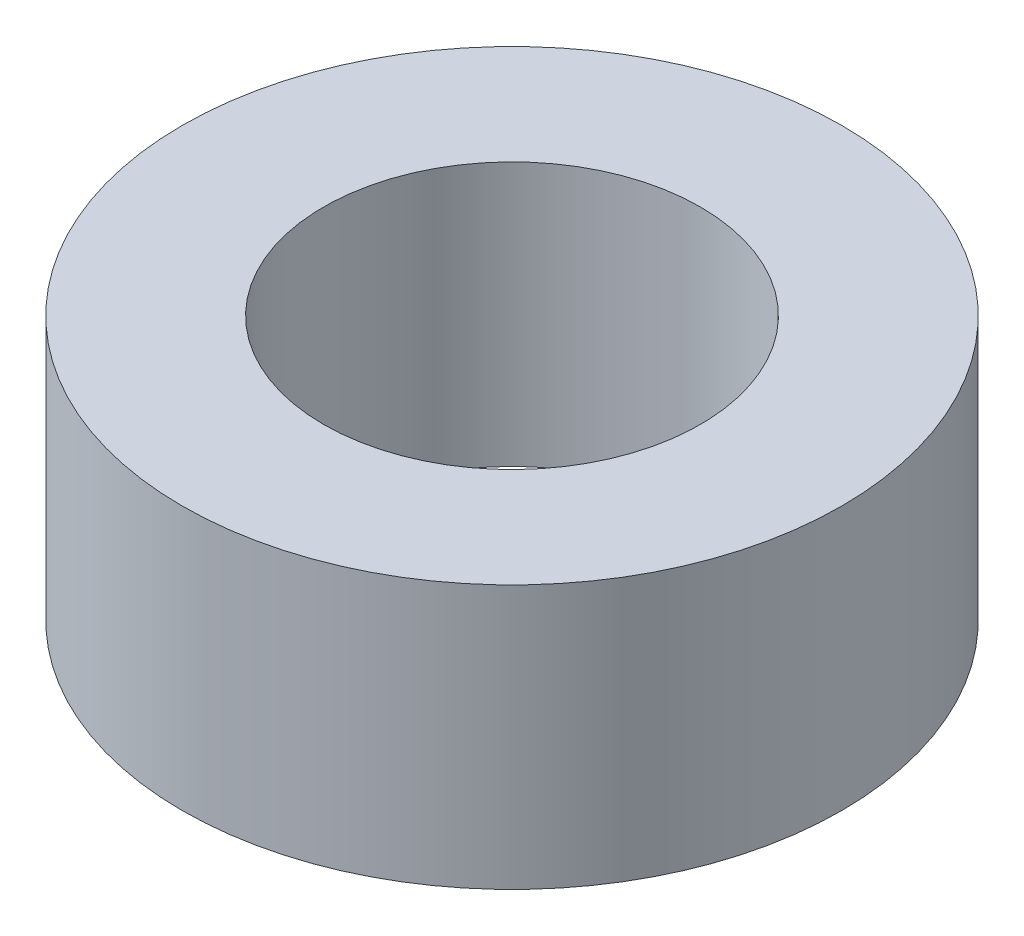
ISO-10303-21;
HEADER;
FILE_DESCRIPTION(('STEP AP214'),'2;1');
FILE_NAME('part.step','',(''),(''),'','','');
FILE_SCHEMA(('AUTOMOTIVE_DESIGN { 1 0 10303 214 1 1 1 1 }'));
ENDSEC;
DATA;
#1=APPLICATION_CONTEXT('core data for automotive mechanical design processes');
#2=APPLICATION_PROTOCOL_DEFINITION('international standard','automotive_design',2000,#1);
#3=PRODUCT_CONTEXT('',#1,'mechanical');
#4=PRODUCT('Part','Part','',(#3));
#5=PRODUCT_RELATED_PRODUCT_CATEGORY('part','',(#4));
#6=PRODUCT_DEFINITION_FORMATION('','',#4);
#7=PRODUCT_DEFINITION_CONTEXT('part definition',#1,'design');
#8=PRODUCT_DEFINITION('design','',#6,#7);
#9=PRODUCT_DEFINITION_SHAPE('','',#8);
#10=(LENGTH_UNIT() NAMED_UNIT(*) SI_UNIT(.MILLI.,.METRE.));
#11=(NAMED_UNIT(*) PLANE_ANGLE_UNIT() SI_UNIT($,.RADIAN.));
#12=(NAMED_UNIT(*) SI_UNIT($,.STERADIAN.) SOLID_ANGLE_UNIT());
#13=UNCERTAINTY_MEASURE_WITH_UNIT(LENGTH_MEASURE(1.E-05),#10,'distance_accuracy_value','');
#14=(GEOMETRIC_REPRESENTATION_CONTEXT(3) GLOBAL_UNCERTAINTY_ASSIGNED_CONTEXT((#13)) GLOBAL_UNIT_ASSIGNED_CONTEXT((#10,
#11,#12)) REPRESENTATION_CONTEXT('',''));
#15=CARTESIAN_POINT('',(0.,0.,0.));
#16=DIRECTION('',(0.,0.,1.));
#17=DIRECTION('',(1.,0.,0.));
#18=AXIS2_PLACEMENT_3D('',#15,#16,#17);
#19=CARTESIAN_POINT('',(0.,2.8,0.));
#20=DIRECTION('',(0.,1.,0.));
#21=DIRECTION('',(0.,0.,1.));
#22=AXIS2_PLACEMENT_3D('',#19,#20,#21);
#23=PLANE('',#22);
#24=CARTESIAN_POINT('',(0.,2.8,0.));
#25=DIRECTION('',(0.,1.,0.));
#26=DIRECTION('',(0.,0.,1.));
#27=AXIS2_PLACEMENT_3D('',#24,#25,#26);
#28=CIRCLE('',#27,3.5);
#29=CARTESIAN_POINT('',(0.,2.8,3.5));
#30=VERTEX_POINT('',#29);
#31=EDGE_CURVE('E10',#30,#30,#28,.T.);
#32=ORIENTED_EDGE('',*,*,#31,.T.);
#33=EDGE_LOOP('',(#32));
#34=FACE_BOUND('',#33,.T.);
#35=CARTESIAN_POINT('',(0.,2.8,0.));
#36=DIRECTION('',(0.,1.,0.));
#37=DIRECTION('',(0.,0.,1.));
#38=AXIS2_PLACEMENT_3D('',#35,#36,#37);
#39=CIRCLE('',#38,2.);
#40=CARTESIAN_POINT('',(0.,2.8,2.));
#41=VERTEX_POINT('',#40);
#42=EDGE_CURVE('E43',#41,#41,#39,.T.);
#43=ORIENTED_EDGE('',*,*,#42,.F.);
#44=EDGE_LOOP('',(#43));
#45=FACE_BOUND('',#44,.T.);
#46=ADVANCED_FACE('F32',(#34,#45),#23,.T.);
#47=CARTESIAN_POINT('',(0.,0.,0.));
#48=DIRECTION('',(0.,1.,0.));
#49=DIRECTION('',(0.,0.,1.));
#50=AXIS2_PLACEMENT_3D('',#47,#48,#49);
#51=PLANE('',#50);
#52=CARTESIAN_POINT('',(0.,0.,0.));
#53=DIRECTION('',(0.,1.,0.));
#54=DIRECTION('',(0.,0.,1.));
#55=AXIS2_PLACEMENT_3D('',#52,#53,#54);
#56=CIRCLE('',#55,3.5);
#57=CARTESIAN_POINT('',(0.,0.,3.5));
#58=VERTEX_POINT('',#57);
#59=EDGE_CURVE('E36',#58,#58,#56,.T.);
#60=ORIENTED_EDGE('',*,*,#59,.F.);
#61=EDGE_LOOP('',(#60));
#62=FACE_BOUND('',#61,.T.);
#63=CARTESIAN_POINT('',(0.,0.,0.));
#64=DIRECTION('',(0.,1.,0.));
#65=DIRECTION('',(0.,0.,1.));
#66=AXIS2_PLACEMENT_3D('',#63,#64,#65);
#67=CIRCLE('',#66,2.);
#68=CARTESIAN_POINT('',(0.,0.,2.));
#69=VERTEX_POINT('',#68);
#70=EDGE_CURVE('E45',#69,#69,#67,.T.);
#71=ORIENTED_EDGE('',*,*,#70,.T.);
#72=EDGE_LOOP('',(#71));
#73=FACE_BOUND('',#72,.T.);
#74=ADVANCED_FACE('F55',(#62,#73),#51,.F.);
#75=CARTESIAN_POINT('',(0.,2.8,0.));
#76=DIRECTION('',(0.,-1.,0.));
#77=DIRECTION('',(0.,0.,-1.));
#78=AXIS2_PLACEMENT_3D('',#75,#76,#77);
#79=CYLINDRICAL_SURFACE('',#78,3.5);
#80=ORIENTED_EDGE('',*,*,#31,.F.);
#81=EDGE_LOOP('',(#80));
#82=FACE_BOUND('',#81,.T.);
#83=ORIENTED_EDGE('',*,*,#59,.T.);
#84=EDGE_LOOP('',(#83));
#85=FACE_BOUND('',#84,.T.);
#86=ADVANCED_FACE('F34',(#82,#85),#79,.T.);
#87=CARTESIAN_POINT('',(0.,2.8,0.));
#88=DIRECTION('',(0.,-1.,0.));
#89=DIRECTION('',(0.,0.,-1.));
#90=AXIS2_PLACEMENT_3D('',#87,#88,#89);
#91=CYLINDRICAL_SURFACE('',#90,2.);
#92=ORIENTED_EDGE('',*,*,#42,.T.);
#93=EDGE_LOOP('',(#92));
#94=FACE_BOUND('',#93,.T.);
#95=ORIENTED_EDGE('',*,*,#70,.F.);
#96=EDGE_LOOP('',(#95));
#97=FACE_BOUND('',#96,.T.);
#98=ADVANCED_FACE('F51',(#94,#97),#91,.F.);
#99=CLOSED_SHELL('',(#46,#74,#86,#98));
#100=MANIFOLD_SOLID_BREP('B2',#99);
#101=ADVANCED_BREP_SHAPE_REPRESENTATION('',(#18,#100),#14);
#102=SHAPE_DEFINITION_REPRESENTATION(#9,#101);
ENDSEC;
END-ISO-10303-21;
